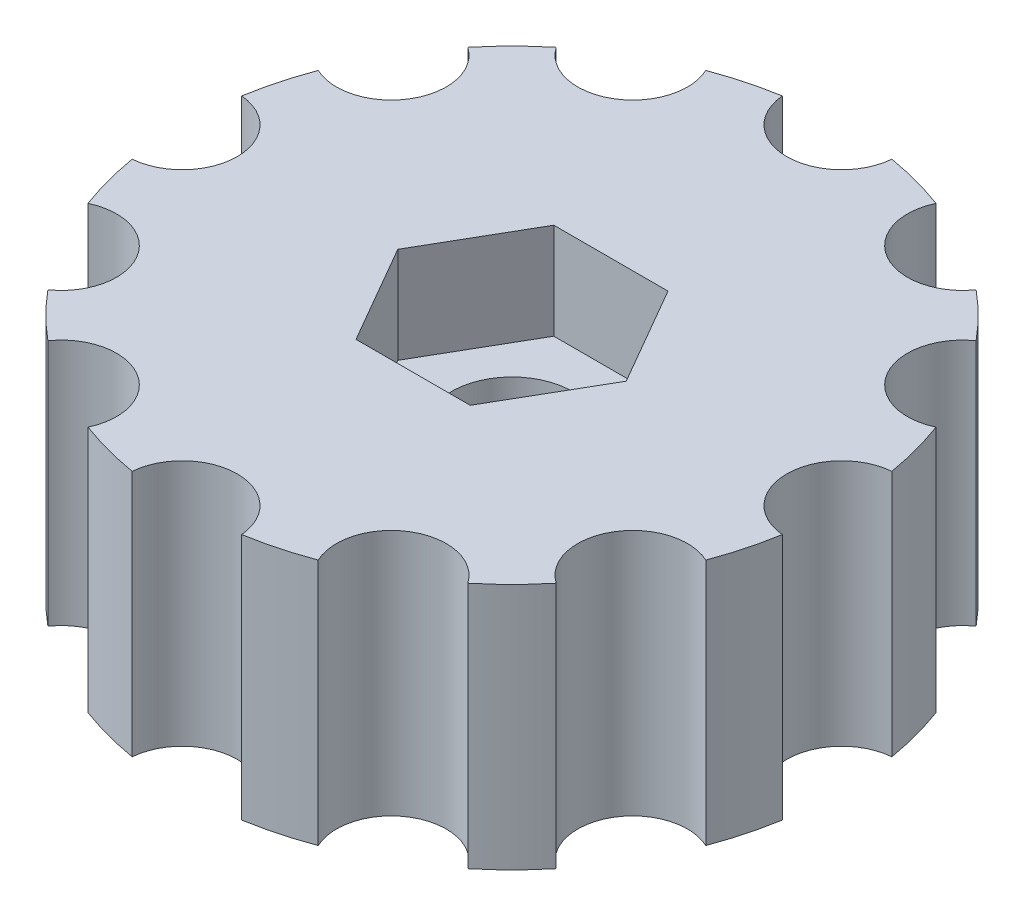
ISO-10303-21;
HEADER;
FILE_DESCRIPTION(('STEP AP214'),'2;1');
FILE_NAME('part.step','',(''),(''),'','','');
FILE_SCHEMA(('AUTOMOTIVE_DESIGN { 1 0 10303 214 1 1 1 1 }'));
ENDSEC;
DATA;
#1=APPLICATION_CONTEXT('core data for automotive mechanical design processes');
#2=APPLICATION_PROTOCOL_DEFINITION('international standard','automotive_design',2000,#1);
#3=PRODUCT_CONTEXT('',#1,'mechanical');
#4=PRODUCT('Part','Part','',(#3));
#5=PRODUCT_RELATED_PRODUCT_CATEGORY('part','',(#4));
#6=PRODUCT_DEFINITION_FORMATION('','',#4);
#7=PRODUCT_DEFINITION_CONTEXT('part definition',#1,'design');
#8=PRODUCT_DEFINITION('design','',#6,#7);
#9=PRODUCT_DEFINITION_SHAPE('','',#8);
#10=(LENGTH_UNIT() NAMED_UNIT(*) SI_UNIT(.MILLI.,.METRE.));
#11=(NAMED_UNIT(*) PLANE_ANGLE_UNIT() SI_UNIT($,.RADIAN.));
#12=(NAMED_UNIT(*) SI_UNIT($,.STERADIAN.) SOLID_ANGLE_UNIT());
#13=UNCERTAINTY_MEASURE_WITH_UNIT(LENGTH_MEASURE(1.E-05),#10,'distance_accuracy_value','');
#14=(GEOMETRIC_REPRESENTATION_CONTEXT(3) GLOBAL_UNCERTAINTY_ASSIGNED_CONTEXT((#13)) GLOBAL_UNIT_ASSIGNED_CONTEXT((#10,
#11,#12)) REPRESENTATION_CONTEXT('',''));
#15=CARTESIAN_POINT('',(0.,0.,0.));
#16=DIRECTION('',(0.,0.,1.));
#17=DIRECTION('',(1.,0.,0.));
#18=AXIS2_PLACEMENT_3D('',#15,#16,#17);
#19=CARTESIAN_POINT('',(0.,9.,0.));
#20=DIRECTION('',(0.,-1.,0.));
#21=DIRECTION('',(0.,0.,-1.));
#22=AXIS2_PLACEMENT_3D('',#19,#20,#21);
#23=CYLINDRICAL_SURFACE('',#22,2.2);
#24=CARTESIAN_POINT('',(0.,-2.,0.));
#25=DIRECTION('',(0.,1.,0.));
#26=DIRECTION('',(0.,0.,1.));
#27=AXIS2_PLACEMENT_3D('',#24,#25,#26);
#28=CIRCLE('',#27,2.2);
#29=CARTESIAN_POINT('',(0.,-2.,2.2));
#30=VERTEX_POINT('',#29);
#31=EDGE_CURVE('E290',#30,#30,#28,.T.);
#32=ORIENTED_EDGE('',*,*,#31,.F.);
#33=EDGE_LOOP('',(#32));
#34=FACE_BOUND('',#33,.T.);
#35=CARTESIAN_POINT('',(0.,5.5,0.));
#36=DIRECTION('',(0.,1.,0.));
#37=DIRECTION('',(0.,0.,1.));
#38=AXIS2_PLACEMENT_3D('',#35,#36,#37);
#39=CIRCLE('',#38,2.2);
#40=CARTESIAN_POINT('',(0.,5.5,2.2));
#41=VERTEX_POINT('',#40);
#42=EDGE_CURVE('E43',#41,#41,#39,.T.);
#43=ORIENTED_EDGE('',*,*,#42,.T.);
#44=EDGE_LOOP('',(#43));
#45=FACE_BOUND('',#44,.T.);
#46=ADVANCED_FACE('F39',(#34,#45),#23,.F.);
#47=CARTESIAN_POINT('',(0.,9.,0.));
#48=DIRECTION('',(0.,-1.,0.));
#49=DIRECTION('',(0.,0.,-1.));
#50=AXIS2_PLACEMENT_3D('',#47,#48,#49);
#51=CYLINDRICAL_SURFACE('',#50,12.);
#52=DIRECTION('',(0.,-1.,0.));
#53=VECTOR('',#52,1.);
#54=CARTESIAN_POINT('',(-7.642692931434,4.499994,9.25144554952407));
#55=LINE('',#54,#53);
#56=CARTESIAN_POINT('',(-7.642692931434,9.,9.25144554952407));
#57=VERTEX_POINT('',#56);
#58=CARTESIAN_POINT('',(-7.642692931434,0.,9.25144554952408));
#59=VERTEX_POINT('',#58);
#60=EDGE_CURVE('E368',#57,#59,#55,.T.);
#61=ORIENTED_EDGE('',*,*,#60,.F.);
#62=CARTESIAN_POINT('',(0.,9.,0.));
#63=DIRECTION('',(0.,1.,0.));
#64=DIRECTION('',(0.,0.,1.));
#65=AXIS2_PLACEMENT_3D('',#62,#63,#64);
#66=CIRCLE('',#65,12.);
#67=CARTESIAN_POINT('',(-9.25144554952407,9.,7.642692931434));
#68=VERTEX_POINT('',#67);
#69=EDGE_CURVE('E416',#68,#57,#66,.T.);
#70=ORIENTED_EDGE('',*,*,#69,.F.);
#71=DIRECTION('',(0.,-1.,0.));
#72=VECTOR('',#71,1.);
#73=CARTESIAN_POINT('',(-9.25144554952407,4.499994,7.642692931434));
#74=LINE('',#73,#72);
#75=CARTESIAN_POINT('',(-9.25144554952408,0.,7.64269293143399));
#76=VERTEX_POINT('',#75);
#77=EDGE_CURVE('E362',#76,#68,#74,.F.);
#78=ORIENTED_EDGE('',*,*,#77,.F.);
#79=CARTESIAN_POINT('',(0.,0.,0.));
#80=DIRECTION('',(0.,1.,0.));
#81=DIRECTION('',(0.,0.,1.));
#82=AXIS2_PLACEMENT_3D('',#79,#80,#81);
#83=CIRCLE('',#82,12.);
#84=EDGE_CURVE('E414',#76,#59,#83,.T.);
#85=ORIENTED_EDGE('',*,*,#84,.T.);
#86=EDGE_LOOP('',(#61,#70,#78,#85));
#87=FACE_BOUND('',#86,.T.);
#88=ADVANCED_FACE('F41',(#87),#51,.T.);
#89=DIRECTION('',(0.,-1.,0.));
#90=VECTOR('',#89,1.);
#91=CARTESIAN_POINT('',(-4.19064040189934,4.499994,11.2444890067076));
#92=LINE('',#91,#90);
#93=CARTESIAN_POINT('',(-4.19064040189935,0.,11.2444890067076));
#94=VERTEX_POINT('',#93);
#95=CARTESIAN_POINT('',(-4.19064040189934,9.,11.2444890067076));
#96=VERTEX_POINT('',#95);
#97=EDGE_CURVE('E366',#94,#96,#92,.F.);
#98=ORIENTED_EDGE('',*,*,#97,.F.);
#99=CARTESIAN_POINT('',(-1.99304345718356,0.,11.8333333333333));
#100=VERTEX_POINT('',#99);
#101=EDGE_CURVE('E370',#94,#100,#83,.T.);
#102=ORIENTED_EDGE('',*,*,#101,.T.);
#103=DIRECTION('',(0.,-1.,0.));
#104=VECTOR('',#103,1.);
#105=CARTESIAN_POINT('',(-1.99304345718357,4.499994,11.8333333333333));
#106=LINE('',#105,#104);
#107=CARTESIAN_POINT('',(-1.99304345718357,9.,11.8333333333333));
#108=VERTEX_POINT('',#107);
#109=EDGE_CURVE('E63',#108,#100,#106,.T.);
#110=ORIENTED_EDGE('',*,*,#109,.F.);
#111=EDGE_CURVE('E376',#96,#108,#66,.T.);
#112=ORIENTED_EDGE('',*,*,#111,.F.);
#113=EDGE_LOOP('',(#98,#102,#110,#112));
#114=FACE_BOUND('',#113,.T.);
#115=ADVANCED_FACE('F425',(#114),#51,.T.);
#116=DIRECTION('',(0.,-1.,0.));
#117=VECTOR('',#116,1.);
#118=CARTESIAN_POINT('',(-11.2444890067076,4.499994,4.19064040189934));
#119=LINE('',#118,#117);
#120=CARTESIAN_POINT('',(-11.2444890067076,9.,4.19064040189934));
#121=VERTEX_POINT('',#120);
#122=CARTESIAN_POINT('',(-11.2444890067076,0.,4.19064040189935));
#123=VERTEX_POINT('',#122);
#124=EDGE_CURVE('E364',#121,#123,#119,.T.);
#125=ORIENTED_EDGE('',*,*,#124,.F.);
#126=CARTESIAN_POINT('',(-11.8333333333333,9.,1.99304345718357));
#127=VERTEX_POINT('',#126);
#128=EDGE_CURVE('E443',#127,#121,#66,.T.);
#129=ORIENTED_EDGE('',*,*,#128,.F.);
#130=DIRECTION('',(0.,-1.,0.));
#131=VECTOR('',#130,1.);
#132=CARTESIAN_POINT('',(-11.8333333333333,4.499994,1.99304345718357));
#133=LINE('',#132,#131);
#134=CARTESIAN_POINT('',(-11.8333333333333,0.,1.99304345718356));
#135=VERTEX_POINT('',#134);
#136=EDGE_CURVE('E358',#135,#127,#133,.F.);
#137=ORIENTED_EDGE('',*,*,#136,.F.);
#138=EDGE_CURVE('E420',#135,#123,#83,.T.);
#139=ORIENTED_EDGE('',*,*,#138,.T.);
#140=EDGE_LOOP('',(#125,#129,#137,#139));
#141=FACE_BOUND('',#140,.T.);
#142=ADVANCED_FACE('F533',(#141),#51,.T.);
#143=DIRECTION('',(0.,-1.,0.));
#144=VECTOR('',#143,1.);
#145=CARTESIAN_POINT('',(-11.8333333333333,4.499994,-1.99304345718357));
#146=LINE('',#145,#144);
#147=CARTESIAN_POINT('',(-11.8333333333333,9.,-1.99304345718357));
#148=VERTEX_POINT('',#147);
#149=CARTESIAN_POINT('',(-11.8333333333333,0.,-1.99304345718356));
#150=VERTEX_POINT('',#149);
#151=EDGE_CURVE('E360',#148,#150,#146,.T.);
#152=ORIENTED_EDGE('',*,*,#151,.F.);
#153=CARTESIAN_POINT('',(-11.2444890067076,9.,-4.19064040189933));
#154=VERTEX_POINT('',#153);
#155=EDGE_CURVE('E445',#154,#148,#66,.T.);
#156=ORIENTED_EDGE('',*,*,#155,.F.);
#157=DIRECTION('',(0.,-1.,0.));
#158=VECTOR('',#157,1.);
#159=CARTESIAN_POINT('',(-11.2444890067076,4.499994,-4.19064040189933));
#160=LINE('',#159,#158);
#161=CARTESIAN_POINT('',(-11.2444890067076,0.,-4.19064040189934));
#162=VERTEX_POINT('',#161);
#163=EDGE_CURVE('E354',#162,#154,#160,.F.);
#164=ORIENTED_EDGE('',*,*,#163,.F.);
#165=EDGE_CURVE('E421',#162,#150,#83,.T.);
#166=ORIENTED_EDGE('',*,*,#165,.T.);
#167=EDGE_LOOP('',(#152,#156,#164,#166));
#168=FACE_BOUND('',#167,.T.);
#169=ADVANCED_FACE('F526',(#168),#51,.T.);
#170=DIRECTION('',(0.,-1.,0.));
#171=VECTOR('',#170,1.);
#172=CARTESIAN_POINT('',(-9.25144554952408,4.499994,-7.642692931434));
#173=LINE('',#172,#171);
#174=CARTESIAN_POINT('',(-9.25144554952408,9.,-7.642692931434));
#175=VERTEX_POINT('',#174);
#176=CARTESIAN_POINT('',(-9.25144554952408,0.,-7.64269293143399));
#177=VERTEX_POINT('',#176);
#178=EDGE_CURVE('E356',#175,#177,#173,.T.);
#179=ORIENTED_EDGE('',*,*,#178,.F.);
#180=CARTESIAN_POINT('',(-7.642692931434,9.,-9.25144554952408));
#181=VERTEX_POINT('',#180);
#182=EDGE_CURVE('E449',#181,#175,#66,.T.);
#183=ORIENTED_EDGE('',*,*,#182,.F.);
#184=DIRECTION('',(0.,-1.,0.));
#185=VECTOR('',#184,1.);
#186=CARTESIAN_POINT('',(-7.642692931434,4.499994,-9.25144554952408));
#187=LINE('',#186,#185);
#188=CARTESIAN_POINT('',(-7.64269293143399,0.,-9.25144554952408));
#189=VERTEX_POINT('',#188);
#190=EDGE_CURVE('E350',#189,#181,#187,.F.);
#191=ORIENTED_EDGE('',*,*,#190,.F.);
#192=EDGE_CURVE('E511',#189,#177,#83,.T.);
#193=ORIENTED_EDGE('',*,*,#192,.T.);
#194=EDGE_LOOP('',(#179,#183,#191,#193));
#195=FACE_BOUND('',#194,.T.);
#196=ADVANCED_FACE('F539',(#195),#51,.T.);
#197=DIRECTION('',(0.,-1.,0.));
#198=VECTOR('',#197,1.);
#199=CARTESIAN_POINT('',(-4.19064040189933,4.499994,-11.2444890067076));
#200=LINE('',#199,#198);
#201=CARTESIAN_POINT('',(-4.19064040189933,9.,-11.2444890067076));
#202=VERTEX_POINT('',#201);
#203=CARTESIAN_POINT('',(-4.19064040189934,0.,-11.2444890067076));
#204=VERTEX_POINT('',#203);
#205=EDGE_CURVE('E352',#202,#204,#200,.T.);
#206=ORIENTED_EDGE('',*,*,#205,.F.);
#207=CARTESIAN_POINT('',(-1.99304345718357,9.,-11.8333333333333));
#208=VERTEX_POINT('',#207);
#209=EDGE_CURVE('E453',#208,#202,#66,.T.);
#210=ORIENTED_EDGE('',*,*,#209,.F.);
#211=DIRECTION('',(0.,-1.,0.));
#212=VECTOR('',#211,1.);
#213=CARTESIAN_POINT('',(-1.99304345718357,4.499994,-11.8333333333333));
#214=LINE('',#213,#212);
#215=CARTESIAN_POINT('',(-1.99304345718356,0.,-11.8333333333333));
#216=VERTEX_POINT('',#215);
#217=EDGE_CURVE('E346',#216,#208,#214,.F.);
#218=ORIENTED_EDGE('',*,*,#217,.F.);
#219=EDGE_CURVE('E505',#216,#204,#83,.T.);
#220=ORIENTED_EDGE('',*,*,#219,.T.);
#221=EDGE_LOOP('',(#206,#210,#218,#220));
#222=FACE_BOUND('',#221,.T.);
#223=ADVANCED_FACE('F746',(#222),#51,.T.);
#224=DIRECTION('',(0.,-1.,0.));
#225=VECTOR('',#224,1.);
#226=CARTESIAN_POINT('',(1.99304345718357,4.499994,-11.8333333333333));
#227=LINE('',#226,#225);
#228=CARTESIAN_POINT('',(1.99304345718357,9.,-11.8333333333333));
#229=VERTEX_POINT('',#228);
#230=CARTESIAN_POINT('',(1.99304345718356,0.,-11.8333333333333));
#231=VERTEX_POINT('',#230);
#232=EDGE_CURVE('E348',#229,#231,#227,.T.);
#233=ORIENTED_EDGE('',*,*,#232,.F.);
#234=CARTESIAN_POINT('',(4.19064040189934,9.,-11.2444890067076));
#235=VERTEX_POINT('',#234);
#236=EDGE_CURVE('E457',#235,#229,#66,.T.);
#237=ORIENTED_EDGE('',*,*,#236,.F.);
#238=DIRECTION('',(0.,-1.,0.));
#239=VECTOR('',#238,1.);
#240=CARTESIAN_POINT('',(4.19064040189934,4.499994,-11.2444890067076));
#241=LINE('',#240,#239);
#242=CARTESIAN_POINT('',(4.19064040189935,0.,-11.2444890067076));
#243=VERTEX_POINT('',#242);
#244=EDGE_CURVE('E342',#243,#235,#241,.F.);
#245=ORIENTED_EDGE('',*,*,#244,.F.);
#246=EDGE_CURVE('E499',#243,#231,#83,.T.);
#247=ORIENTED_EDGE('',*,*,#246,.T.);
#248=EDGE_LOOP('',(#233,#237,#245,#247));
#249=FACE_BOUND('',#248,.T.);
#250=ADVANCED_FACE('F739',(#249),#51,.T.);
#251=DIRECTION('',(0.,-1.,0.));
#252=VECTOR('',#251,1.);
#253=CARTESIAN_POINT('',(7.642692931434,4.499994,-9.25144554952407));
#254=LINE('',#253,#252);
#255=CARTESIAN_POINT('',(7.642692931434,9.,-9.25144554952407));
#256=VERTEX_POINT('',#255);
#257=CARTESIAN_POINT('',(7.64269293143399,0.,-9.25144554952408));
#258=VERTEX_POINT('',#257);
#259=EDGE_CURVE('E344',#256,#258,#254,.T.);
#260=ORIENTED_EDGE('',*,*,#259,.F.);
#261=CARTESIAN_POINT('',(9.25144554952408,9.,-7.642692931434));
#262=VERTEX_POINT('',#261);
#263=EDGE_CURVE('E461',#262,#256,#66,.T.);
#264=ORIENTED_EDGE('',*,*,#263,.F.);
#265=DIRECTION('',(0.,-1.,0.));
#266=VECTOR('',#265,1.);
#267=CARTESIAN_POINT('',(9.25144554952408,4.499994,-7.642692931434));
#268=LINE('',#267,#266);
#269=CARTESIAN_POINT('',(9.25144554952408,0.,-7.64269293143399));
#270=VERTEX_POINT('',#269);
#271=EDGE_CURVE('E338',#270,#262,#268,.F.);
#272=ORIENTED_EDGE('',*,*,#271,.F.);
#273=EDGE_CURVE('E494',#270,#258,#83,.T.);
#274=ORIENTED_EDGE('',*,*,#273,.T.);
#275=EDGE_LOOP('',(#260,#264,#272,#274));
#276=FACE_BOUND('',#275,.T.);
#277=ADVANCED_FACE('F731',(#276),#51,.T.);
#278=DIRECTION('',(0.,-1.,0.));
#279=VECTOR('',#278,1.);
#280=CARTESIAN_POINT('',(11.2444890067076,4.499994,-4.19064040189933));
#281=LINE('',#280,#279);
#282=CARTESIAN_POINT('',(11.2444890067076,9.,-4.19064040189933));
#283=VERTEX_POINT('',#282);
#284=CARTESIAN_POINT('',(11.2444890067076,0.,-4.19064040189934));
#285=VERTEX_POINT('',#284);
#286=EDGE_CURVE('E340',#283,#285,#281,.T.);
#287=ORIENTED_EDGE('',*,*,#286,.F.);
#288=CARTESIAN_POINT('',(11.8333333333333,9.,-1.99304345718357));
#289=VERTEX_POINT('',#288);
#290=EDGE_CURVE('E465',#289,#283,#66,.T.);
#291=ORIENTED_EDGE('',*,*,#290,.F.);
#292=DIRECTION('',(0.,-1.,0.));
#293=VECTOR('',#292,1.);
#294=CARTESIAN_POINT('',(11.8333333333333,4.499994,-1.99304345718357));
#295=LINE('',#294,#293);
#296=CARTESIAN_POINT('',(11.8333333333333,0.,-1.99304345718356));
#297=VERTEX_POINT('',#296);
#298=EDGE_CURVE('E323',#297,#289,#295,.F.);
#299=ORIENTED_EDGE('',*,*,#298,.F.);
#300=EDGE_CURVE('E492',#297,#285,#83,.T.);
#301=ORIENTED_EDGE('',*,*,#300,.T.);
#302=EDGE_LOOP('',(#287,#291,#299,#301));
#303=FACE_BOUND('',#302,.T.);
#304=ADVANCED_FACE('F724',(#303),#51,.T.);
#305=DIRECTION('',(0.,-1.,0.));
#306=VECTOR('',#305,1.);
#307=CARTESIAN_POINT('',(1.99304345718356,4.499994,11.8333333333333));
#308=LINE('',#307,#306);
#309=CARTESIAN_POINT('',(1.99304345718356,0.,11.8333333333333));
#310=VERTEX_POINT('',#309);
#311=CARTESIAN_POINT('',(1.99304345718356,9.,11.8333333333333));
#312=VERTEX_POINT('',#311);
#313=EDGE_CURVE('E335',#310,#312,#308,.F.);
#314=ORIENTED_EDGE('',*,*,#313,.F.);
#315=CARTESIAN_POINT('',(4.19064040189935,0.,11.2444890067076));
#316=VERTEX_POINT('',#315);
#317=EDGE_CURVE('E377',#310,#316,#83,.T.);
#318=ORIENTED_EDGE('',*,*,#317,.T.);
#319=DIRECTION('',(0.,-1.,0.));
#320=VECTOR('',#319,1.);
#321=CARTESIAN_POINT('',(4.19064040189934,4.499994,11.2444890067076));
#322=LINE('',#321,#320);
#323=CARTESIAN_POINT('',(4.19064040189934,9.,11.2444890067076));
#324=VERTEX_POINT('',#323);
#325=EDGE_CURVE('E333',#324,#316,#322,.T.);
#326=ORIENTED_EDGE('',*,*,#325,.F.);
#327=EDGE_CURVE('E371',#312,#324,#66,.T.);
#328=ORIENTED_EDGE('',*,*,#327,.F.);
#329=EDGE_LOOP('',(#314,#318,#326,#328));
#330=FACE_BOUND('',#329,.T.);
#331=ADVANCED_FACE('F435',(#330),#51,.T.);
#332=DIRECTION('',(0.,-1.,0.));
#333=VECTOR('',#332,1.);
#334=CARTESIAN_POINT('',(7.642692931434,4.499994,9.25144554952407));
#335=LINE('',#334,#333);
#336=CARTESIAN_POINT('',(7.64269293143399,0.,9.25144554952408));
#337=VERTEX_POINT('',#336);
#338=CARTESIAN_POINT('',(7.642692931434,9.,9.25144554952407));
#339=VERTEX_POINT('',#338);
#340=EDGE_CURVE('E331',#337,#339,#335,.F.);
#341=ORIENTED_EDGE('',*,*,#340,.F.);
#342=CARTESIAN_POINT('',(9.25144554952408,0.,7.642692931434));
#343=VERTEX_POINT('',#342);
#344=EDGE_CURVE('E380',#337,#343,#83,.T.);
#345=ORIENTED_EDGE('',*,*,#344,.T.);
#346=DIRECTION('',(0.,-1.,0.));
#347=VECTOR('',#346,1.);
#348=CARTESIAN_POINT('',(9.25144554952407,4.499994,7.642692931434));
#349=LINE('',#348,#347);
#350=CARTESIAN_POINT('',(9.25144554952407,9.,7.642692931434));
#351=VERTEX_POINT('',#350);
#352=EDGE_CURVE('E329',#351,#343,#349,.T.);
#353=ORIENTED_EDGE('',*,*,#352,.F.);
#354=EDGE_CURVE('E375',#339,#351,#66,.T.);
#355=ORIENTED_EDGE('',*,*,#354,.F.);
#356=EDGE_LOOP('',(#341,#345,#353,#355));
#357=FACE_BOUND('',#356,.T.);
#358=ADVANCED_FACE('F478',(#357),#51,.T.);
#359=DIRECTION('',(0.,-1.,0.));
#360=VECTOR('',#359,1.);
#361=CARTESIAN_POINT('',(11.2444890067076,4.499994,4.19064040189934));
#362=LINE('',#361,#360);
#363=CARTESIAN_POINT('',(11.2444890067076,0.,4.19064040189935));
#364=VERTEX_POINT('',#363);
#365=CARTESIAN_POINT('',(11.2444890067076,9.,4.19064040189934));
#366=VERTEX_POINT('',#365);
#367=EDGE_CURVE('E327',#364,#366,#362,.F.);
#368=ORIENTED_EDGE('',*,*,#367,.F.);
#369=CARTESIAN_POINT('',(11.8333333333333,0.,1.99304345718356));
#370=VERTEX_POINT('',#369);
#371=EDGE_CURVE('E488',#364,#370,#83,.T.);
#372=ORIENTED_EDGE('',*,*,#371,.T.);
#373=DIRECTION('',(0.,-1.,0.));
#374=VECTOR('',#373,1.);
#375=CARTESIAN_POINT('',(11.8333333333333,4.499994,1.99304345718357));
#376=LINE('',#375,#374);
#377=CARTESIAN_POINT('',(11.8333333333333,9.,1.99304345718357));
#378=VERTEX_POINT('',#377);
#379=EDGE_CURVE('E325',#378,#370,#376,.T.);
#380=ORIENTED_EDGE('',*,*,#379,.F.);
#381=EDGE_CURVE('E469',#366,#378,#66,.T.);
#382=ORIENTED_EDGE('',*,*,#381,.F.);
#383=EDGE_LOOP('',(#368,#372,#380,#382));
#384=FACE_BOUND('',#383,.T.);
#385=ADVANCED_FACE('F548',(#384),#51,.T.);
#386=CARTESIAN_POINT('',(0.,9.,0.));
#387=DIRECTION('',(0.,1.,0.));
#388=DIRECTION('',(0.,0.,1.));
#389=AXIS2_PLACEMENT_3D('',#386,#387,#388);
#390=PLANE('',#389);
#391=DIRECTION('',(0.5,0.,-0.866025403784439));
#392=VECTOR('',#391,1.);
#393=CARTESIAN_POINT('',(2.07846096908265,9.,3.6));
#394=LINE('',#393,#392);
#395=CARTESIAN_POINT('',(2.07846096908265,9.,3.6));
#396=VERTEX_POINT('',#395);
#397=CARTESIAN_POINT('',(4.15692193816531,9.,0.));
#398=VERTEX_POINT('',#397);
#399=EDGE_CURVE('E55',#396,#398,#394,.T.);
#400=ORIENTED_EDGE('',*,*,#399,.F.);
#401=DIRECTION('',(1.,0.,0.));
#402=VECTOR('',#401,1.);
#403=CARTESIAN_POINT('',(-2.07846096908265,9.,3.6));
#404=LINE('',#403,#402);
#405=CARTESIAN_POINT('',(-2.07846096908265,9.,3.6));
#406=VERTEX_POINT('',#405);
#407=EDGE_CURVE('E257',#406,#396,#404,.T.);
#408=ORIENTED_EDGE('',*,*,#407,.F.);
#409=DIRECTION('',(0.5,0.,0.866025403784439));
#410=VECTOR('',#409,1.);
#411=CARTESIAN_POINT('',(-4.15692193816531,9.,0.));
#412=LINE('',#411,#410);
#413=CARTESIAN_POINT('',(-4.15692193816531,9.,0.));
#414=VERTEX_POINT('',#413);
#415=EDGE_CURVE('E260',#414,#406,#412,.T.);
#416=ORIENTED_EDGE('',*,*,#415,.F.);
#417=DIRECTION('',(-0.5,0.,0.866025403784438));
#418=VECTOR('',#417,1.);
#419=CARTESIAN_POINT('',(-2.07846096908265,9.,-3.6));
#420=LINE('',#419,#418);
#421=CARTESIAN_POINT('',(-2.07846096908265,9.,-3.6));
#422=VERTEX_POINT('',#421);
#423=EDGE_CURVE('E276',#422,#414,#420,.T.);
#424=ORIENTED_EDGE('',*,*,#423,.F.);
#425=DIRECTION('',(-1.,0.,0.));
#426=VECTOR('',#425,1.);
#427=CARTESIAN_POINT('',(2.07846096908265,9.,-3.6));
#428=LINE('',#427,#426);
#429=CARTESIAN_POINT('',(2.07846096908265,9.,-3.6));
#430=VERTEX_POINT('',#429);
#431=EDGE_CURVE('E273',#430,#422,#428,.T.);
#432=ORIENTED_EDGE('',*,*,#431,.F.);
#433=DIRECTION('',(-0.5,0.,-0.866025403784439));
#434=VECTOR('',#433,1.);
#435=CARTESIAN_POINT('',(4.15692193816531,9.,0.));
#436=LINE('',#435,#434);
#437=EDGE_CURVE('E271',#398,#430,#436,.T.);
#438=ORIENTED_EDGE('',*,*,#437,.F.);
#439=EDGE_LOOP('',(#400,#408,#416,#424,#432,#438));
#440=FACE_BOUND('',#439,.T.);
#441=ORIENTED_EDGE('',*,*,#69,.T.);
#442=CARTESIAN_POINT('',(-6.00000000000001,9.,10.3923048454133));
#443=DIRECTION('',(0.,1.,0.));
#444=DIRECTION('',(0.,0.,1.));
#445=AXIS2_PLACEMENT_3D('',#442,#443,#444);
#446=CIRCLE('',#445,2.);
#447=EDGE_CURVE('E302',#96,#57,#446,.T.);
#448=ORIENTED_EDGE('',*,*,#447,.F.);
#449=ORIENTED_EDGE('',*,*,#111,.T.);
#450=CARTESIAN_POINT('',(0.,9.,12.));
#451=DIRECTION('',(0.,1.,0.));
#452=DIRECTION('',(0.,0.,1.));
#453=AXIS2_PLACEMENT_3D('',#450,#451,#452);
#454=CIRCLE('',#453,2.);
#455=EDGE_CURVE('E300',#312,#108,#454,.T.);
#456=ORIENTED_EDGE('',*,*,#455,.F.);
#457=ORIENTED_EDGE('',*,*,#327,.T.);
#458=CARTESIAN_POINT('',(6.,9.,10.3923048454133));
#459=DIRECTION('',(0.,1.,0.));
#460=DIRECTION('',(0.,0.,1.));
#461=AXIS2_PLACEMENT_3D('',#458,#459,#460);
#462=CIRCLE('',#461,2.);
#463=EDGE_CURVE('E303',#339,#324,#462,.T.);
#464=ORIENTED_EDGE('',*,*,#463,.F.);
#465=ORIENTED_EDGE('',*,*,#354,.T.);
#466=CARTESIAN_POINT('',(10.3923048454133,9.,6.00000000000001));
#467=DIRECTION('',(0.,1.,0.));
#468=DIRECTION('',(0.,0.,1.));
#469=AXIS2_PLACEMENT_3D('',#466,#467,#468);
#470=CIRCLE('',#469,2.);
#471=EDGE_CURVE('E297',#366,#351,#470,.T.);
#472=ORIENTED_EDGE('',*,*,#471,.F.);
#473=ORIENTED_EDGE('',*,*,#381,.T.);
#474=CARTESIAN_POINT('',(12.,9.,0.));
#475=DIRECTION('',(0.,1.,0.));
#476=DIRECTION('',(0.,0.,1.));
#477=AXIS2_PLACEMENT_3D('',#474,#475,#476);
#478=CIRCLE('',#477,2.);
#479=EDGE_CURVE('E316',#289,#378,#478,.T.);
#480=ORIENTED_EDGE('',*,*,#479,.F.);
#481=ORIENTED_EDGE('',*,*,#290,.T.);
#482=CARTESIAN_POINT('',(10.3923048454133,9.,-6.));
#483=DIRECTION('',(0.,1.,0.));
#484=DIRECTION('',(0.,0.,1.));
#485=AXIS2_PLACEMENT_3D('',#482,#483,#484);
#486=CIRCLE('',#485,2.);
#487=EDGE_CURVE('E314',#262,#283,#486,.T.);
#488=ORIENTED_EDGE('',*,*,#487,.F.);
#489=ORIENTED_EDGE('',*,*,#263,.T.);
#490=CARTESIAN_POINT('',(6.,9.,-10.3923048454133));
#491=DIRECTION('',(0.,1.,0.));
#492=DIRECTION('',(0.,0.,1.));
#493=AXIS2_PLACEMENT_3D('',#490,#491,#492);
#494=CIRCLE('',#493,2.);
#495=EDGE_CURVE('E317',#235,#256,#494,.T.);
#496=ORIENTED_EDGE('',*,*,#495,.F.);
#497=ORIENTED_EDGE('',*,*,#236,.T.);
#498=CARTESIAN_POINT('',(0.,9.,-12.));
#499=DIRECTION('',(0.,1.,0.));
#500=DIRECTION('',(0.,0.,1.));
#501=AXIS2_PLACEMENT_3D('',#498,#499,#500);
#502=CIRCLE('',#501,2.);
#503=EDGE_CURVE('E319',#208,#229,#502,.T.);
#504=ORIENTED_EDGE('',*,*,#503,.F.);
#505=ORIENTED_EDGE('',*,*,#209,.T.);
#506=CARTESIAN_POINT('',(-6.,9.,-10.3923048454133));
#507=DIRECTION('',(0.,1.,0.));
#508=DIRECTION('',(0.,0.,1.));
#509=AXIS2_PLACEMENT_3D('',#506,#507,#508);
#510=CIRCLE('',#509,2.);
#511=EDGE_CURVE('E308',#181,#202,#510,.T.);
#512=ORIENTED_EDGE('',*,*,#511,.F.);
#513=ORIENTED_EDGE('',*,*,#182,.T.);
#514=CARTESIAN_POINT('',(-10.3923048454133,9.,-6.));
#515=DIRECTION('',(0.,1.,0.));
#516=DIRECTION('',(0.,0.,1.));
#517=AXIS2_PLACEMENT_3D('',#514,#515,#516);
#518=CIRCLE('',#517,2.);
#519=EDGE_CURVE('E306',#154,#175,#518,.T.);
#520=ORIENTED_EDGE('',*,*,#519,.F.);
#521=ORIENTED_EDGE('',*,*,#155,.T.);
#522=CARTESIAN_POINT('',(-12.,9.,0.));
#523=DIRECTION('',(0.,1.,0.));
#524=DIRECTION('',(0.,0.,1.));
#525=AXIS2_PLACEMENT_3D('',#522,#523,#524);
#526=CIRCLE('',#525,2.);
#527=EDGE_CURVE('E309',#127,#148,#526,.T.);
#528=ORIENTED_EDGE('',*,*,#527,.F.);
#529=ORIENTED_EDGE('',*,*,#128,.T.);
#530=CARTESIAN_POINT('',(-10.3923048454133,9.,6.));
#531=DIRECTION('',(0.,1.,0.));
#532=DIRECTION('',(0.,0.,1.));
#533=AXIS2_PLACEMENT_3D('',#530,#531,#532);
#534=CIRCLE('',#533,2.);
#535=EDGE_CURVE('E311',#68,#121,#534,.T.);
#536=ORIENTED_EDGE('',*,*,#535,.F.);
#537=EDGE_LOOP('',(#441,#448,#449,#456,#457,#464,#465,#472,#473,#480,#481,#488,#489,#496,#497,
#504,#505,#512,#513,#520,#521,#528,#529,#536));
#538=FACE_BOUND('',#537,.T.);
#539=ADVANCED_FACE('F439',(#440,#538),#390,.T.);
#540=CARTESIAN_POINT('',(0.,0.,0.));
#541=DIRECTION('',(0.,1.,0.));
#542=DIRECTION('',(0.,0.,1.));
#543=AXIS2_PLACEMENT_3D('',#540,#541,#542);
#544=PLANE('',#543);
#545=CARTESIAN_POINT('',(0.,0.,0.));
#546=DIRECTION('',(0.,1.,0.));
#547=DIRECTION('',(0.,0.,1.));
#548=AXIS2_PLACEMENT_3D('',#545,#546,#547);
#549=CIRCLE('',#548,5.5);
#550=CARTESIAN_POINT('',(0.,0.,5.5));
#551=VERTEX_POINT('',#550);
#552=EDGE_CURVE('E293',#551,#551,#549,.T.);
#553=ORIENTED_EDGE('',*,*,#552,.T.);
#554=EDGE_LOOP('',(#553));
#555=FACE_BOUND('',#554,.T.);
#556=CARTESIAN_POINT('',(-6.00000000000001,0.,10.3923048454133));
#557=DIRECTION('',(0.,1.,0.));
#558=DIRECTION('',(0.,0.,1.));
#559=AXIS2_PLACEMENT_3D('',#556,#557,#558);
#560=CIRCLE('',#559,2.);
#561=EDGE_CURVE('E11',#59,#94,#560,.F.);
#562=ORIENTED_EDGE('',*,*,#561,.F.);
#563=ORIENTED_EDGE('',*,*,#84,.F.);
#564=CARTESIAN_POINT('',(-10.3923048454133,0.,6.));
#565=DIRECTION('',(0.,1.,0.));
#566=DIRECTION('',(0.,0.,1.));
#567=AXIS2_PLACEMENT_3D('',#564,#565,#566);
#568=CIRCLE('',#567,2.);
#569=EDGE_CURVE('E48',#123,#76,#568,.F.);
#570=ORIENTED_EDGE('',*,*,#569,.F.);
#571=ORIENTED_EDGE('',*,*,#138,.F.);
#572=CARTESIAN_POINT('',(-12.,0.,0.));
#573=DIRECTION('',(0.,1.,0.));
#574=DIRECTION('',(0.,0.,1.));
#575=AXIS2_PLACEMENT_3D('',#572,#573,#574);
#576=CIRCLE('',#575,2.);
#577=EDGE_CURVE('E398',#150,#135,#576,.F.);
#578=ORIENTED_EDGE('',*,*,#577,.F.);
#579=ORIENTED_EDGE('',*,*,#165,.F.);
#580=CARTESIAN_POINT('',(-10.3923048454133,0.,-6.));
#581=DIRECTION('',(0.,1.,0.));
#582=DIRECTION('',(0.,0.,1.));
#583=AXIS2_PLACEMENT_3D('',#580,#581,#582);
#584=CIRCLE('',#583,2.);
#585=EDGE_CURVE('E396',#177,#162,#584,.F.);
#586=ORIENTED_EDGE('',*,*,#585,.F.);
#587=ORIENTED_EDGE('',*,*,#192,.F.);
#588=CARTESIAN_POINT('',(-6.,0.,-10.3923048454133));
#589=DIRECTION('',(0.,1.,0.));
#590=DIRECTION('',(0.,0.,1.));
#591=AXIS2_PLACEMENT_3D('',#588,#589,#590);
#592=CIRCLE('',#591,2.);
#593=EDGE_CURVE('E394',#204,#189,#592,.F.);
#594=ORIENTED_EDGE('',*,*,#593,.F.);
#595=ORIENTED_EDGE('',*,*,#219,.F.);
#596=CARTESIAN_POINT('',(0.,0.,-12.));
#597=DIRECTION('',(0.,1.,0.));
#598=DIRECTION('',(0.,0.,1.));
#599=AXIS2_PLACEMENT_3D('',#596,#597,#598);
#600=CIRCLE('',#599,2.);
#601=EDGE_CURVE('E392',#231,#216,#600,.F.);
#602=ORIENTED_EDGE('',*,*,#601,.F.);
#603=ORIENTED_EDGE('',*,*,#246,.F.);
#604=CARTESIAN_POINT('',(6.,0.,-10.3923048454133));
#605=DIRECTION('',(0.,1.,0.));
#606=DIRECTION('',(0.,0.,1.));
#607=AXIS2_PLACEMENT_3D('',#604,#605,#606);
#608=CIRCLE('',#607,2.);
#609=EDGE_CURVE('E390',#258,#243,#608,.F.);
#610=ORIENTED_EDGE('',*,*,#609,.F.);
#611=ORIENTED_EDGE('',*,*,#273,.F.);
#612=CARTESIAN_POINT('',(10.3923048454133,0.,-6.));
#613=DIRECTION('',(0.,1.,0.));
#614=DIRECTION('',(0.,0.,1.));
#615=AXIS2_PLACEMENT_3D('',#612,#613,#614);
#616=CIRCLE('',#615,2.);
#617=EDGE_CURVE('E388',#285,#270,#616,.F.);
#618=ORIENTED_EDGE('',*,*,#617,.F.);
#619=ORIENTED_EDGE('',*,*,#300,.F.);
#620=CARTESIAN_POINT('',(12.,0.,0.));
#621=DIRECTION('',(0.,1.,0.));
#622=DIRECTION('',(0.,0.,1.));
#623=AXIS2_PLACEMENT_3D('',#620,#621,#622);
#624=CIRCLE('',#623,2.);
#625=EDGE_CURVE('E374',#370,#297,#624,.F.);
#626=ORIENTED_EDGE('',*,*,#625,.F.);
#627=ORIENTED_EDGE('',*,*,#371,.F.);
#628=CARTESIAN_POINT('',(10.3923048454133,0.,6.00000000000001));
#629=DIRECTION('',(0.,1.,0.));
#630=DIRECTION('',(0.,0.,1.));
#631=AXIS2_PLACEMENT_3D('',#628,#629,#630);
#632=CIRCLE('',#631,2.);
#633=EDGE_CURVE('E382',#343,#364,#632,.F.);
#634=ORIENTED_EDGE('',*,*,#633,.F.);
#635=ORIENTED_EDGE('',*,*,#344,.F.);
#636=CARTESIAN_POINT('',(6.,0.,10.3923048454133));
#637=DIRECTION('',(0.,1.,0.));
#638=DIRECTION('',(0.,0.,1.));
#639=AXIS2_PLACEMENT_3D('',#636,#637,#638);
#640=CIRCLE('',#639,2.);
#641=EDGE_CURVE('E384',#316,#337,#640,.F.);
#642=ORIENTED_EDGE('',*,*,#641,.F.);
#643=ORIENTED_EDGE('',*,*,#317,.F.);
#644=CARTESIAN_POINT('',(0.,0.,12.));
#645=DIRECTION('',(0.,1.,0.));
#646=DIRECTION('',(0.,0.,1.));
#647=AXIS2_PLACEMENT_3D('',#644,#645,#646);
#648=CIRCLE('',#647,2.);
#649=EDGE_CURVE('E386',#100,#310,#648,.F.);
#650=ORIENTED_EDGE('',*,*,#649,.F.);
#651=ORIENTED_EDGE('',*,*,#101,.F.);
#652=EDGE_LOOP('',(#562,#563,#570,#571,#578,#579,#586,#587,#594,#595,#602,#603,#610,#611,#618,
#619,#626,#627,#634,#635,#642,#643,#650,#651));
#653=FACE_BOUND('',#652,.T.);
#654=ADVANCED_FACE('F418',(#555,#653),#544,.F.);
#655=CARTESIAN_POINT('',(12.,9.,0.));
#656=DIRECTION('',(0.,-1.,0.));
#657=DIRECTION('',(0.,0.,-1.));
#658=AXIS2_PLACEMENT_3D('',#655,#656,#657);
#659=CYLINDRICAL_SURFACE('',#658,2.);
#660=ORIENTED_EDGE('',*,*,#379,.T.);
#661=ORIENTED_EDGE('',*,*,#625,.T.);
#662=ORIENTED_EDGE('',*,*,#298,.T.);
#663=ORIENTED_EDGE('',*,*,#479,.T.);
#664=EDGE_LOOP('',(#660,#661,#662,#663));
#665=FACE_BOUND('',#664,.T.);
#666=ADVANCED_FACE('F571',(#665),#659,.F.);
#667=CARTESIAN_POINT('',(10.3923048454133,9.,6.00000000000001));
#668=DIRECTION('',(0.,-1.,0.));
#669=DIRECTION('',(0.,0.,-1.));
#670=AXIS2_PLACEMENT_3D('',#667,#668,#669);
#671=CYLINDRICAL_SURFACE('',#670,2.);
#672=ORIENTED_EDGE('',*,*,#352,.T.);
#673=ORIENTED_EDGE('',*,*,#633,.T.);
#674=ORIENTED_EDGE('',*,*,#367,.T.);
#675=ORIENTED_EDGE('',*,*,#471,.T.);
#676=EDGE_LOOP('',(#672,#673,#674,#675));
#677=FACE_BOUND('',#676,.T.);
#678=ADVANCED_FACE('F483',(#677),#671,.F.);
#679=CARTESIAN_POINT('',(6.,9.,10.3923048454133));
#680=DIRECTION('',(0.,-1.,0.));
#681=DIRECTION('',(0.,0.,-1.));
#682=AXIS2_PLACEMENT_3D('',#679,#680,#681);
#683=CYLINDRICAL_SURFACE('',#682,2.);
#684=ORIENTED_EDGE('',*,*,#325,.T.);
#685=ORIENTED_EDGE('',*,*,#641,.T.);
#686=ORIENTED_EDGE('',*,*,#340,.T.);
#687=ORIENTED_EDGE('',*,*,#463,.T.);
#688=EDGE_LOOP('',(#684,#685,#686,#687));
#689=FACE_BOUND('',#688,.T.);
#690=ADVANCED_FACE('F565',(#689),#683,.F.);
#691=CARTESIAN_POINT('',(0.,9.,12.));
#692=DIRECTION('',(0.,-1.,0.));
#693=DIRECTION('',(0.,0.,-1.));
#694=AXIS2_PLACEMENT_3D('',#691,#692,#693);
#695=CYLINDRICAL_SURFACE('',#694,2.);
#696=ORIENTED_EDGE('',*,*,#109,.T.);
#697=ORIENTED_EDGE('',*,*,#649,.T.);
#698=ORIENTED_EDGE('',*,*,#313,.T.);
#699=ORIENTED_EDGE('',*,*,#455,.T.);
#700=EDGE_LOOP('',(#696,#697,#698,#699));
#701=FACE_BOUND('',#700,.T.);
#702=ADVANCED_FACE('F431',(#701),#695,.F.);
#703=CARTESIAN_POINT('',(10.3923048454133,9.,-6.));
#704=DIRECTION('',(0.,-1.,0.));
#705=DIRECTION('',(0.,0.,-1.));
#706=AXIS2_PLACEMENT_3D('',#703,#704,#705);
#707=CYLINDRICAL_SURFACE('',#706,2.);
#708=ORIENTED_EDGE('',*,*,#286,.T.);
#709=ORIENTED_EDGE('',*,*,#617,.T.);
#710=ORIENTED_EDGE('',*,*,#271,.T.);
#711=ORIENTED_EDGE('',*,*,#487,.T.);
#712=EDGE_LOOP('',(#708,#709,#710,#711));
#713=FACE_BOUND('',#712,.T.);
#714=ADVANCED_FACE('F564',(#713),#707,.F.);
#715=CARTESIAN_POINT('',(6.,9.,-10.3923048454133));
#716=DIRECTION('',(0.,-1.,0.));
#717=DIRECTION('',(0.,0.,-1.));
#718=AXIS2_PLACEMENT_3D('',#715,#716,#717);
#719=CYLINDRICAL_SURFACE('',#718,2.);
#720=ORIENTED_EDGE('',*,*,#259,.T.);
#721=ORIENTED_EDGE('',*,*,#609,.T.);
#722=ORIENTED_EDGE('',*,*,#244,.T.);
#723=ORIENTED_EDGE('',*,*,#495,.T.);
#724=EDGE_LOOP('',(#720,#721,#722,#723));
#725=FACE_BOUND('',#724,.T.);
#726=ADVANCED_FACE('F586',(#725),#719,.F.);
#727=CARTESIAN_POINT('',(0.,9.,-12.));
#728=DIRECTION('',(0.,-1.,0.));
#729=DIRECTION('',(0.,0.,-1.));
#730=AXIS2_PLACEMENT_3D('',#727,#728,#729);
#731=CYLINDRICAL_SURFACE('',#730,2.);
#732=ORIENTED_EDGE('',*,*,#232,.T.);
#733=ORIENTED_EDGE('',*,*,#601,.T.);
#734=ORIENTED_EDGE('',*,*,#217,.T.);
#735=ORIENTED_EDGE('',*,*,#503,.T.);
#736=EDGE_LOOP('',(#732,#733,#734,#735));
#737=FACE_BOUND('',#736,.T.);
#738=ADVANCED_FACE('F590',(#737),#731,.F.);
#739=CARTESIAN_POINT('',(-6.,9.,-10.3923048454133));
#740=DIRECTION('',(0.,-1.,0.));
#741=DIRECTION('',(0.,0.,-1.));
#742=AXIS2_PLACEMENT_3D('',#739,#740,#741);
#743=CYLINDRICAL_SURFACE('',#742,2.);
#744=ORIENTED_EDGE('',*,*,#205,.T.);
#745=ORIENTED_EDGE('',*,*,#593,.T.);
#746=ORIENTED_EDGE('',*,*,#190,.T.);
#747=ORIENTED_EDGE('',*,*,#511,.T.);
#748=EDGE_LOOP('',(#744,#745,#746,#747));
#749=FACE_BOUND('',#748,.T.);
#750=ADVANCED_FACE('F575',(#749),#743,.F.);
#751=CARTESIAN_POINT('',(-10.3923048454133,9.,-6.));
#752=DIRECTION('',(0.,-1.,0.));
#753=DIRECTION('',(0.,0.,-1.));
#754=AXIS2_PLACEMENT_3D('',#751,#752,#753);
#755=CYLINDRICAL_SURFACE('',#754,2.);
#756=ORIENTED_EDGE('',*,*,#178,.T.);
#757=ORIENTED_EDGE('',*,*,#585,.T.);
#758=ORIENTED_EDGE('',*,*,#163,.T.);
#759=ORIENTED_EDGE('',*,*,#519,.T.);
#760=EDGE_LOOP('',(#756,#757,#758,#759));
#761=FACE_BOUND('',#760,.T.);
#762=ADVANCED_FACE('F572',(#761),#755,.F.);
#763=CARTESIAN_POINT('',(-12.,9.,0.));
#764=DIRECTION('',(0.,-1.,0.));
#765=DIRECTION('',(0.,0.,-1.));
#766=AXIS2_PLACEMENT_3D('',#763,#764,#765);
#767=CYLINDRICAL_SURFACE('',#766,2.);
#768=ORIENTED_EDGE('',*,*,#151,.T.);
#769=ORIENTED_EDGE('',*,*,#577,.T.);
#770=ORIENTED_EDGE('',*,*,#136,.T.);
#771=ORIENTED_EDGE('',*,*,#527,.T.);
#772=EDGE_LOOP('',(#768,#769,#770,#771));
#773=FACE_BOUND('',#772,.T.);
#774=ADVANCED_FACE('F531',(#773),#767,.F.);
#775=CARTESIAN_POINT('',(-10.3923048454133,9.,6.));
#776=DIRECTION('',(0.,-1.,0.));
#777=DIRECTION('',(0.,0.,-1.));
#778=AXIS2_PLACEMENT_3D('',#775,#776,#777);
#779=CYLINDRICAL_SURFACE('',#778,2.);
#780=ORIENTED_EDGE('',*,*,#124,.T.);
#781=ORIENTED_EDGE('',*,*,#569,.T.);
#782=ORIENTED_EDGE('',*,*,#77,.T.);
#783=ORIENTED_EDGE('',*,*,#535,.T.);
#784=EDGE_LOOP('',(#780,#781,#782,#783));
#785=FACE_BOUND('',#784,.T.);
#786=ADVANCED_FACE('F403',(#785),#779,.F.);
#787=CARTESIAN_POINT('',(-6.00000000000001,9.,10.3923048454133));
#788=DIRECTION('',(0.,-1.,0.));
#789=DIRECTION('',(0.,0.,-1.));
#790=AXIS2_PLACEMENT_3D('',#787,#788,#789);
#791=CYLINDRICAL_SURFACE('',#790,2.);
#792=ORIENTED_EDGE('',*,*,#60,.T.);
#793=ORIENTED_EDGE('',*,*,#561,.T.);
#794=ORIENTED_EDGE('',*,*,#97,.T.);
#795=ORIENTED_EDGE('',*,*,#447,.T.);
#796=EDGE_LOOP('',(#792,#793,#794,#795));
#797=FACE_BOUND('',#796,.T.);
#798=ADVANCED_FACE('F560',(#797),#791,.F.);
#799=CARTESIAN_POINT('',(0.,-2.,0.));
#800=DIRECTION('',(0.,1.,0.));
#801=DIRECTION('',(0.,0.,1.));
#802=AXIS2_PLACEMENT_3D('',#799,#800,#801);
#803=CYLINDRICAL_SURFACE('',#802,5.5);
#804=CARTESIAN_POINT('',(0.,-2.,0.));
#805=DIRECTION('',(0.,1.,0.));
#806=DIRECTION('',(0.,0.,1.));
#807=AXIS2_PLACEMENT_3D('',#804,#805,#806);
#808=CIRCLE('',#807,5.5);
#809=CARTESIAN_POINT('',(0.,-2.,5.5));
#810=VERTEX_POINT('',#809);
#811=EDGE_CURVE('E294',#810,#810,#808,.T.);
#812=ORIENTED_EDGE('',*,*,#811,.T.);
#813=EDGE_LOOP('',(#812));
#814=FACE_BOUND('',#813,.T.);
#815=ORIENTED_EDGE('',*,*,#552,.F.);
#816=EDGE_LOOP('',(#815));
#817=FACE_BOUND('',#816,.T.);
#818=ADVANCED_FACE('F556',(#814,#817),#803,.T.);
#819=CARTESIAN_POINT('',(0.,-2.,0.));
#820=DIRECTION('',(0.,1.,0.));
#821=DIRECTION('',(0.,0.,1.));
#822=AXIS2_PLACEMENT_3D('',#819,#820,#821);
#823=PLANE('',#822);
#824=ORIENTED_EDGE('',*,*,#31,.T.);
#825=EDGE_LOOP('',(#824));
#826=FACE_BOUND('',#825,.T.);
#827=ORIENTED_EDGE('',*,*,#811,.F.);
#828=EDGE_LOOP('',(#827));
#829=FACE_BOUND('',#828,.T.);
#830=ADVANCED_FACE('F554',(#826,#829),#823,.F.);
#831=CARTESIAN_POINT('',(2.07846096908265,5.5,3.6));
#832=DIRECTION('',(0.866025403784439,0.,0.5));
#833=DIRECTION('',(0.5,0.,-0.866025403784439));
#834=AXIS2_PLACEMENT_3D('',#831,#832,#833);
#835=PLANE('',#834);
#836=ORIENTED_EDGE('',*,*,#399,.T.);
#837=DIRECTION('',(0.,1.,0.));
#838=VECTOR('',#837,1.);
#839=CARTESIAN_POINT('',(4.15692193816531,5.5,0.));
#840=LINE('',#839,#838);
#841=CARTESIAN_POINT('',(4.15692193816531,5.5,0.));
#842=VERTEX_POINT('',#841);
#843=EDGE_CURVE('E234',#842,#398,#840,.T.);
#844=ORIENTED_EDGE('',*,*,#843,.F.);
#845=DIRECTION('',(0.5,0.,-0.866025403784439));
#846=VECTOR('',#845,1.);
#847=CARTESIAN_POINT('',(2.07846096908265,5.5,3.6));
#848=LINE('',#847,#846);
#849=CARTESIAN_POINT('',(2.07846096908265,5.5,3.6));
#850=VERTEX_POINT('',#849);
#851=EDGE_CURVE('E238',#850,#842,#848,.T.);
#852=ORIENTED_EDGE('',*,*,#851,.F.);
#853=DIRECTION('',(0.,1.,0.));
#854=VECTOR('',#853,1.);
#855=CARTESIAN_POINT('',(2.07846096908265,5.5,3.6));
#856=LINE('',#855,#854);
#857=EDGE_CURVE('E281',#850,#396,#856,.T.);
#858=ORIENTED_EDGE('',*,*,#857,.T.);
#859=EDGE_LOOP('',(#836,#844,#852,#858));
#860=FACE_BOUND('',#859,.T.);
#861=ADVANCED_FACE('F236',(#860),#835,.F.);
#862=CARTESIAN_POINT('',(-2.07846096908265,5.5,3.6));
#863=DIRECTION('',(0.,0.,1.));
#864=DIRECTION('',(1.,0.,0.));
#865=AXIS2_PLACEMENT_3D('',#862,#863,#864);
#866=PLANE('',#865);
#867=ORIENTED_EDGE('',*,*,#407,.T.);
#868=ORIENTED_EDGE('',*,*,#857,.F.);
#869=DIRECTION('',(1.,0.,0.));
#870=VECTOR('',#869,1.);
#871=CARTESIAN_POINT('',(-2.07846096908265,5.5,3.6));
#872=LINE('',#871,#870);
#873=CARTESIAN_POINT('',(-2.07846096908265,5.5,3.6));
#874=VERTEX_POINT('',#873);
#875=EDGE_CURVE('E244',#874,#850,#872,.T.);
#876=ORIENTED_EDGE('',*,*,#875,.F.);
#877=DIRECTION('',(0.,1.,0.));
#878=VECTOR('',#877,1.);
#879=CARTESIAN_POINT('',(-2.07846096908265,5.5,3.6));
#880=LINE('',#879,#878);
#881=EDGE_CURVE('E283',#874,#406,#880,.T.);
#882=ORIENTED_EDGE('',*,*,#881,.T.);
#883=EDGE_LOOP('',(#867,#868,#876,#882));
#884=FACE_BOUND('',#883,.T.);
#885=ADVANCED_FACE('F636',(#884),#866,.F.);
#886=CARTESIAN_POINT('',(-4.15692193816531,5.5,0.));
#887=DIRECTION('',(-0.866025403784439,0.,0.5));
#888=DIRECTION('',(0.5,0.,0.866025403784439));
#889=AXIS2_PLACEMENT_3D('',#886,#887,#888);
#890=PLANE('',#889);
#891=ORIENTED_EDGE('',*,*,#415,.T.);
#892=ORIENTED_EDGE('',*,*,#881,.F.);
#893=DIRECTION('',(0.5,0.,0.866025403784439));
#894=VECTOR('',#893,1.);
#895=CARTESIAN_POINT('',(-4.15692193816531,5.5,0.));
#896=LINE('',#895,#894);
#897=CARTESIAN_POINT('',(-4.15692193816531,5.5,0.));
#898=VERTEX_POINT('',#897);
#899=EDGE_CURVE('E267',#898,#874,#896,.T.);
#900=ORIENTED_EDGE('',*,*,#899,.F.);
#901=DIRECTION('',(0.,1.,0.));
#902=VECTOR('',#901,1.);
#903=CARTESIAN_POINT('',(-4.15692193816531,5.5,0.));
#904=LINE('',#903,#902);
#905=EDGE_CURVE('E285',#898,#414,#904,.T.);
#906=ORIENTED_EDGE('',*,*,#905,.T.);
#907=EDGE_LOOP('',(#891,#892,#900,#906));
#908=FACE_BOUND('',#907,.T.);
#909=ADVANCED_FACE('F644',(#908),#890,.F.);
#910=CARTESIAN_POINT('',(-2.07846096908265,5.5,-3.6));
#911=DIRECTION('',(-0.866025403784438,0.,-0.5));
#912=DIRECTION('',(-0.5,0.,0.866025403784439));
#913=AXIS2_PLACEMENT_3D('',#910,#911,#912);
#914=PLANE('',#913);
#915=ORIENTED_EDGE('',*,*,#423,.T.);
#916=ORIENTED_EDGE('',*,*,#905,.F.);
#917=DIRECTION('',(-0.5,0.,0.866025403784438));
#918=VECTOR('',#917,1.);
#919=CARTESIAN_POINT('',(-2.07846096908265,5.5,-3.6));
#920=LINE('',#919,#918);
#921=CARTESIAN_POINT('',(-2.07846096908265,5.5,-3.6));
#922=VERTEX_POINT('',#921);
#923=EDGE_CURVE('E264',#922,#898,#920,.T.);
#924=ORIENTED_EDGE('',*,*,#923,.F.);
#925=DIRECTION('',(0.,1.,0.));
#926=VECTOR('',#925,1.);
#927=CARTESIAN_POINT('',(-2.07846096908265,5.5,-3.6));
#928=LINE('',#927,#926);
#929=EDGE_CURVE('E287',#922,#422,#928,.T.);
#930=ORIENTED_EDGE('',*,*,#929,.T.);
#931=EDGE_LOOP('',(#915,#916,#924,#930));
#932=FACE_BOUND('',#931,.T.);
#933=ADVANCED_FACE('F654',(#932),#914,.F.);
#934=CARTESIAN_POINT('',(2.07846096908265,5.5,-3.6));
#935=DIRECTION('',(0.,0.,-1.));
#936=DIRECTION('',(-1.,0.,0.));
#937=AXIS2_PLACEMENT_3D('',#934,#935,#936);
#938=PLANE('',#937);
#939=ORIENTED_EDGE('',*,*,#431,.T.);
#940=ORIENTED_EDGE('',*,*,#929,.F.);
#941=DIRECTION('',(-1.,0.,0.));
#942=VECTOR('',#941,1.);
#943=CARTESIAN_POINT('',(2.07846096908265,5.5,-3.6));
#944=LINE('',#943,#942);
#945=CARTESIAN_POINT('',(2.07846096908265,5.5,-3.6));
#946=VERTEX_POINT('',#945);
#947=EDGE_CURVE('E252',#946,#922,#944,.T.);
#948=ORIENTED_EDGE('',*,*,#947,.F.);
#949=DIRECTION('',(0.,1.,0.));
#950=VECTOR('',#949,1.);
#951=CARTESIAN_POINT('',(2.07846096908265,5.5,-3.6));
#952=LINE('',#951,#950);
#953=EDGE_CURVE('E243',#946,#430,#952,.T.);
#954=ORIENTED_EDGE('',*,*,#953,.T.);
#955=EDGE_LOOP('',(#939,#940,#948,#954));
#956=FACE_BOUND('',#955,.T.);
#957=ADVANCED_FACE('F664',(#956),#938,.F.);
#958=CARTESIAN_POINT('',(4.15692193816531,5.5,0.));
#959=DIRECTION('',(0.866025403784439,0.,-0.5));
#960=DIRECTION('',(-0.5,0.,-0.866025403784439));
#961=AXIS2_PLACEMENT_3D('',#958,#959,#960);
#962=PLANE('',#961);
#963=ORIENTED_EDGE('',*,*,#437,.T.);
#964=ORIENTED_EDGE('',*,*,#953,.F.);
#965=DIRECTION('',(-0.5,0.,-0.866025403784439));
#966=VECTOR('',#965,1.);
#967=CARTESIAN_POINT('',(4.15692193816531,5.5,0.));
#968=LINE('',#967,#966);
#969=EDGE_CURVE('E247',#842,#946,#968,.T.);
#970=ORIENTED_EDGE('',*,*,#969,.F.);
#971=ORIENTED_EDGE('',*,*,#843,.T.);
#972=EDGE_LOOP('',(#963,#964,#970,#971));
#973=FACE_BOUND('',#972,.T.);
#974=ADVANCED_FACE('F248',(#973),#962,.F.);
#975=CARTESIAN_POINT('',(0.,5.5,0.));
#976=DIRECTION('',(0.,1.,0.));
#977=DIRECTION('',(0.,0.,1.));
#978=AXIS2_PLACEMENT_3D('',#975,#976,#977);
#979=PLANE('',#978);
#980=ORIENTED_EDGE('',*,*,#42,.F.);
#981=EDGE_LOOP('',(#980));
#982=FACE_BOUND('',#981,.T.);
#983=ORIENTED_EDGE('',*,*,#851,.T.);
#984=ORIENTED_EDGE('',*,*,#969,.T.);
#985=ORIENTED_EDGE('',*,*,#947,.T.);
#986=ORIENTED_EDGE('',*,*,#923,.T.);
#987=ORIENTED_EDGE('',*,*,#899,.T.);
#988=ORIENTED_EDGE('',*,*,#875,.T.);
#989=EDGE_LOOP('',(#983,#984,#985,#986,#987,#988));
#990=FACE_BOUND('',#989,.T.);
#991=ADVANCED_FACE('F254',(#982,#990),#979,.T.);
#992=CLOSED_SHELL('',(#46,#88,#115,#142,#169,#196,#223,#250,#277,#304,#331,#358,#385,#539,#654,
#666,#678,#690,#702,#714,#726,#738,#750,#762,#774,#786,#798,#818,#830,#861,#885,#909,#933,#957,
#974,#991));
#993=MANIFOLD_SOLID_BREP('B2',#992);
#994=ADVANCED_BREP_SHAPE_REPRESENTATION('',(#18,#993),#14);
#995=SHAPE_DEFINITION_REPRESENTATION(#9,#994);
ENDSEC;
END-ISO-10303-21;
